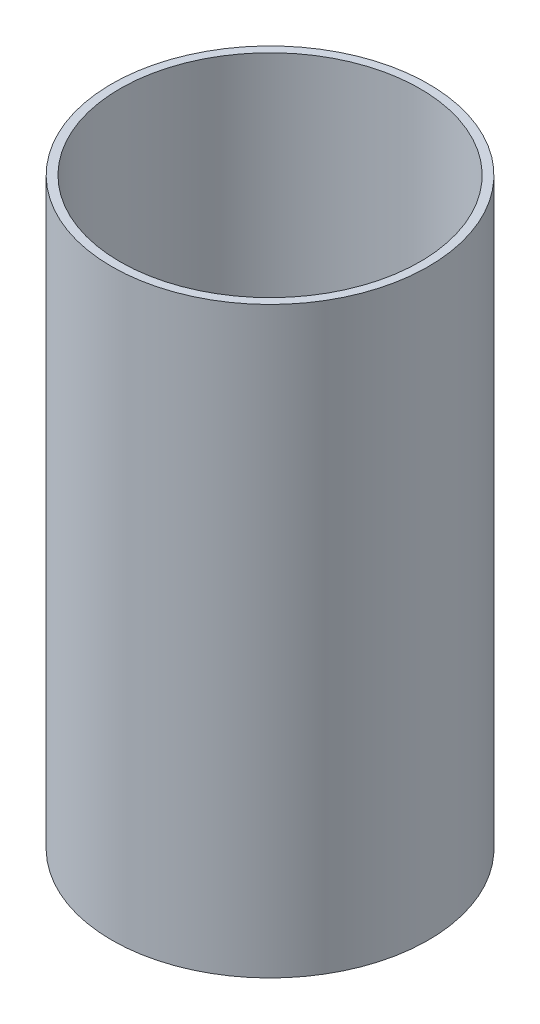
ISO-10303-21;
HEADER;
FILE_DESCRIPTION(('STEP AP214'),'2;1');
FILE_NAME('part.step','',(''),(''),'','','');
FILE_SCHEMA(('AUTOMOTIVE_DESIGN { 1 0 10303 214 1 1 1 1 }'));
ENDSEC;
DATA;
#1=APPLICATION_CONTEXT('core data for automotive mechanical design processes');
#2=APPLICATION_PROTOCOL_DEFINITION('international standard','automotive_design',2000,#1);
#3=PRODUCT_CONTEXT('',#1,'mechanical');
#4=PRODUCT('Part','Part','',(#3));
#5=PRODUCT_RELATED_PRODUCT_CATEGORY('part','',(#4));
#6=PRODUCT_DEFINITION_FORMATION('','',#4);
#7=PRODUCT_DEFINITION_CONTEXT('part definition',#1,'design');
#8=PRODUCT_DEFINITION('design','',#6,#7);
#9=PRODUCT_DEFINITION_SHAPE('','',#8);
#10=(LENGTH_UNIT() NAMED_UNIT(*) SI_UNIT(.MILLI.,.METRE.));
#11=(NAMED_UNIT(*) PLANE_ANGLE_UNIT() SI_UNIT($,.RADIAN.));
#12=(NAMED_UNIT(*) SI_UNIT($,.STERADIAN.) SOLID_ANGLE_UNIT());
#13=UNCERTAINTY_MEASURE_WITH_UNIT(LENGTH_MEASURE(1.E-05),#10,'distance_accuracy_value','');
#14=(GEOMETRIC_REPRESENTATION_CONTEXT(3) GLOBAL_UNCERTAINTY_ASSIGNED_CONTEXT((#13)) GLOBAL_UNIT_ASSIGNED_CONTEXT((#10,
#11,#12)) REPRESENTATION_CONTEXT('',''));
#15=CARTESIAN_POINT('',(0.,0.,0.));
#16=DIRECTION('',(0.,0.,1.));
#17=DIRECTION('',(1.,0.,0.));
#18=AXIS2_PLACEMENT_3D('',#15,#16,#17);
#19=CARTESIAN_POINT('',(0.,177.8,0.));
#20=DIRECTION('',(0.,1.,0.));
#21=DIRECTION('',(0.,0.,1.));
#22=AXIS2_PLACEMENT_3D('',#19,#20,#21);
#23=PLANE('',#22);
#24=CARTESIAN_POINT('',(0.,177.8,0.));
#25=DIRECTION('',(0.,1.,0.));
#26=DIRECTION('',(0.,0.,1.));
#27=AXIS2_PLACEMENT_3D('',#24,#25,#26);
#28=CIRCLE('',#27,48.26);
#29=CARTESIAN_POINT('',(0.,177.8,48.26));
#30=VERTEX_POINT('',#29);
#31=EDGE_CURVE('E10',#30,#30,#28,.T.);
#32=ORIENTED_EDGE('',*,*,#31,.T.);
#33=EDGE_LOOP('',(#32));
#34=FACE_BOUND('',#33,.T.);
#35=CARTESIAN_POINT('',(0.,177.8,0.));
#36=DIRECTION('',(0.,1.,0.));
#37=DIRECTION('',(0.,0.,1.));
#38=AXIS2_PLACEMENT_3D('',#35,#36,#37);
#39=CIRCLE('',#38,45.72);
#40=CARTESIAN_POINT('',(0.,177.8,45.72));
#41=VERTEX_POINT('',#40);
#42=EDGE_CURVE('E51',#41,#41,#39,.T.);
#43=ORIENTED_EDGE('',*,*,#42,.F.);
#44=EDGE_LOOP('',(#43));
#45=FACE_BOUND('',#44,.T.);
#46=ADVANCED_FACE('F38',(#34,#45),#23,.T.);
#47=CARTESIAN_POINT('',(0.,0.,0.));
#48=DIRECTION('',(0.,1.,0.));
#49=DIRECTION('',(0.,0.,1.));
#50=AXIS2_PLACEMENT_3D('',#47,#48,#49);
#51=PLANE('',#50);
#52=CARTESIAN_POINT('',(0.,0.,0.));
#53=DIRECTION('',(0.,1.,0.));
#54=DIRECTION('',(0.,0.,1.));
#55=AXIS2_PLACEMENT_3D('',#52,#53,#54);
#56=CIRCLE('',#55,48.26);
#57=CARTESIAN_POINT('',(0.,0.,48.26));
#58=VERTEX_POINT('',#57);
#59=EDGE_CURVE('E42',#58,#58,#56,.T.);
#60=ORIENTED_EDGE('',*,*,#59,.F.);
#61=EDGE_LOOP('',(#60));
#62=FACE_BOUND('',#61,.T.);
#63=CARTESIAN_POINT('',(0.,0.,0.));
#64=DIRECTION('',(0.,1.,0.));
#65=DIRECTION('',(0.,0.,1.));
#66=AXIS2_PLACEMENT_3D('',#63,#64,#65);
#67=CIRCLE('',#66,45.72);
#68=CARTESIAN_POINT('',(0.,0.,45.72));
#69=VERTEX_POINT('',#68);
#70=EDGE_CURVE('E53',#69,#69,#67,.T.);
#71=ORIENTED_EDGE('',*,*,#70,.T.);
#72=EDGE_LOOP('',(#71));
#73=FACE_BOUND('',#72,.T.);
#74=ADVANCED_FACE('F65',(#62,#73),#51,.F.);
#75=CARTESIAN_POINT('',(0.,177.8,0.));
#76=DIRECTION('',(0.,-1.,0.));
#77=DIRECTION('',(0.,0.,-1.));
#78=AXIS2_PLACEMENT_3D('',#75,#76,#77);
#79=CYLINDRICAL_SURFACE('',#78,48.26);
#80=ORIENTED_EDGE('',*,*,#31,.F.);
#81=EDGE_LOOP('',(#80));
#82=FACE_BOUND('',#81,.T.);
#83=ORIENTED_EDGE('',*,*,#59,.T.);
#84=EDGE_LOOP('',(#83));
#85=FACE_BOUND('',#84,.T.);
#86=ADVANCED_FACE('F40',(#82,#85),#79,.T.);
#87=CARTESIAN_POINT('',(0.,177.8,0.));
#88=DIRECTION('',(0.,-1.,0.));
#89=DIRECTION('',(0.,0.,-1.));
#90=AXIS2_PLACEMENT_3D('',#87,#88,#89);
#91=CYLINDRICAL_SURFACE('',#90,45.72);
#92=ORIENTED_EDGE('',*,*,#42,.T.);
#93=EDGE_LOOP('',(#92));
#94=FACE_BOUND('',#93,.T.);
#95=ORIENTED_EDGE('',*,*,#70,.F.);
#96=EDGE_LOOP('',(#95));
#97=FACE_BOUND('',#96,.T.);
#98=ADVANCED_FACE('F61',(#94,#97),#91,.F.);
#99=CLOSED_SHELL('',(#46,#74,#86,#98));
#100=MANIFOLD_SOLID_BREP('B2',#99);
#101=ADVANCED_BREP_SHAPE_REPRESENTATION('',(#18,#100),#14);
#102=SHAPE_DEFINITION_REPRESENTATION(#9,#101);
ENDSEC;
END-ISO-10303-21;
